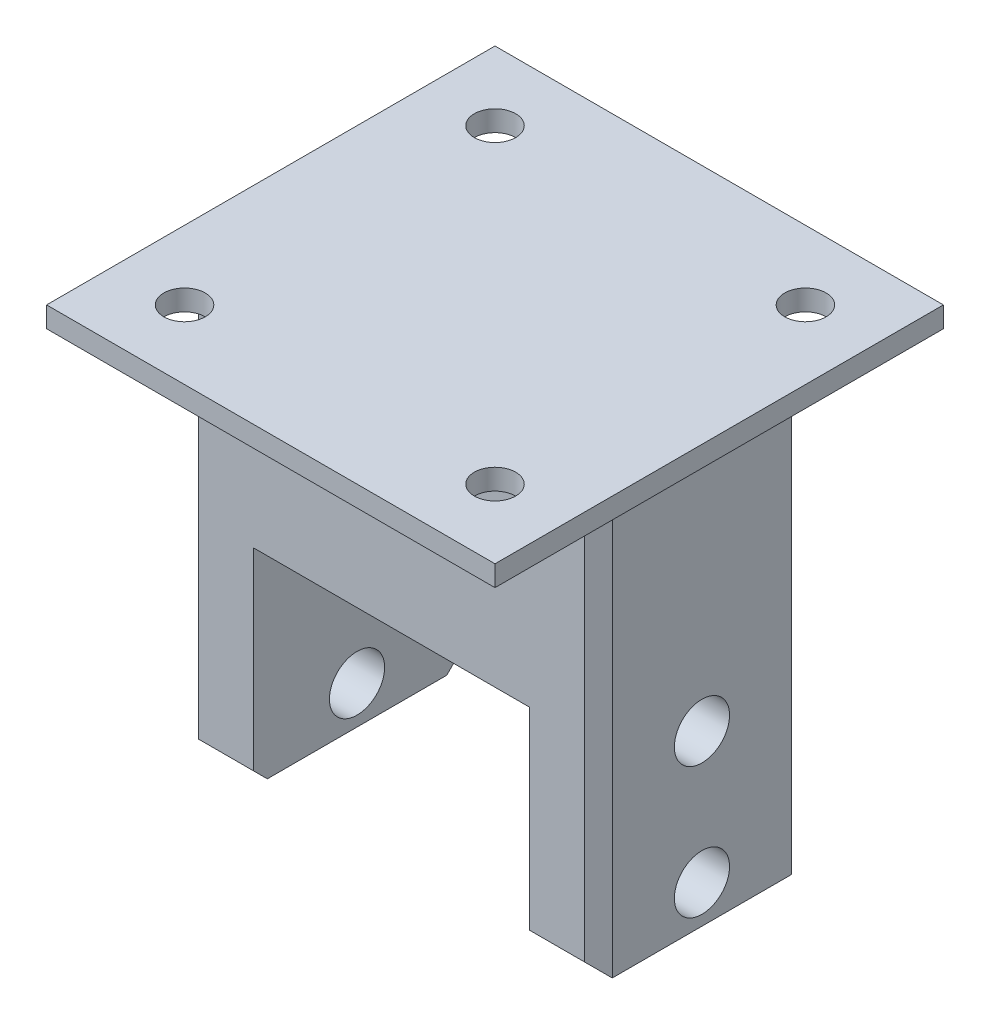
ISO-10303-21;
HEADER;
FILE_DESCRIPTION(('STEP AP214'),'2;1');
FILE_NAME('part.step','',(''),(''),'','','');
FILE_SCHEMA(('AUTOMOTIVE_DESIGN { 1 0 10303 214 1 1 1 1 }'));
ENDSEC;
DATA;
#1=APPLICATION_CONTEXT('core data for automotive mechanical design processes');
#2=APPLICATION_PROTOCOL_DEFINITION('international standard','automotive_design',2000,#1);
#3=PRODUCT_CONTEXT('',#1,'mechanical');
#4=PRODUCT('Part','Part','',(#3));
#5=PRODUCT_RELATED_PRODUCT_CATEGORY('part','',(#4));
#6=PRODUCT_DEFINITION_FORMATION('','',#4);
#7=PRODUCT_DEFINITION_CONTEXT('part definition',#1,'design');
#8=PRODUCT_DEFINITION('design','',#6,#7);
#9=PRODUCT_DEFINITION_SHAPE('','',#8);
#10=(LENGTH_UNIT() NAMED_UNIT(*) SI_UNIT(.MILLI.,.METRE.));
#11=(NAMED_UNIT(*) PLANE_ANGLE_UNIT() SI_UNIT($,.RADIAN.));
#12=(NAMED_UNIT(*) SI_UNIT($,.STERADIAN.) SOLID_ANGLE_UNIT());
#13=UNCERTAINTY_MEASURE_WITH_UNIT(LENGTH_MEASURE(1.E-05),#10,'distance_accuracy_value','');
#14=(GEOMETRIC_REPRESENTATION_CONTEXT(3) GLOBAL_UNCERTAINTY_ASSIGNED_CONTEXT((#13)) GLOBAL_UNIT_ASSIGNED_CONTEXT((#10,
#11,#12)) REPRESENTATION_CONTEXT('',''));
#15=CARTESIAN_POINT('',(0.,0.,0.));
#16=DIRECTION('',(0.,0.,1.));
#17=DIRECTION('',(1.,0.,0.));
#18=AXIS2_PLACEMENT_3D('',#15,#16,#17);
#19=CARTESIAN_POINT('',(-30.,-30.,30.));
#20=DIRECTION('',(1.,0.,0.));
#21=DIRECTION('',(0.,0.,-1.));
#22=AXIS2_PLACEMENT_3D('',#19,#20,#21);
#23=PLANE('',#22);
#24=CARTESIAN_POINT('',(-30.,-24.5,15.));
#25=DIRECTION('',(-1.,0.,0.));
#26=DIRECTION('',(0.,0.,1.));
#27=AXIS2_PLACEMENT_3D('',#24,#25,#26);
#28=CIRCLE('',#27,4.);
#29=CARTESIAN_POINT('',(-30.,-24.5,19.));
#30=VERTEX_POINT('',#29);
#31=EDGE_CURVE('E188',#30,#30,#28,.T.);
#32=ORIENTED_EDGE('',*,*,#31,.F.);
#33=EDGE_LOOP('',(#32));
#34=FACE_BOUND('',#33,.T.);
#35=CARTESIAN_POINT('',(-30.,-5.5,15.));
#36=DIRECTION('',(-1.,0.,0.));
#37=DIRECTION('',(0.,0.,1.));
#38=AXIS2_PLACEMENT_3D('',#35,#36,#37);
#39=CIRCLE('',#38,4.);
#40=CARTESIAN_POINT('',(-30.,-5.5,19.));
#41=VERTEX_POINT('',#40);
#42=EDGE_CURVE('E205',#41,#41,#39,.T.);
#43=ORIENTED_EDGE('',*,*,#42,.F.);
#44=EDGE_LOOP('',(#43));
#45=FACE_BOUND('',#44,.T.);
#46=DIRECTION('',(0.,0.,-1.));
#47=VECTOR('',#46,1.);
#48=CARTESIAN_POINT('',(-30.,-30.,30.));
#49=LINE('',#48,#47);
#50=CARTESIAN_POINT('',(-30.,-30.,28.));
#51=VERTEX_POINT('',#50);
#52=CARTESIAN_POINT('',(-30.,-30.,2.00000000000002));
#53=VERTEX_POINT('',#52);
#54=EDGE_CURVE('E256',#51,#53,#49,.T.);
#55=ORIENTED_EDGE('',*,*,#54,.F.);
#56=DIRECTION('',(0.,1.,0.));
#57=VECTOR('',#56,1.);
#58=CARTESIAN_POINT('',(-30.,-30.,28.));
#59=LINE('',#58,#57);
#60=CARTESIAN_POINT('',(-30.,30.,28.));
#61=VERTEX_POINT('',#60);
#62=EDGE_CURVE('E57',#51,#61,#59,.T.);
#63=ORIENTED_EDGE('',*,*,#62,.T.);
#64=DIRECTION('',(0.,0.,-1.));
#65=VECTOR('',#64,1.);
#66=CARTESIAN_POINT('',(-30.,30.,30.));
#67=LINE('',#66,#65);
#68=CARTESIAN_POINT('',(-30.,30.,2.00000000000002));
#69=VERTEX_POINT('',#68);
#70=EDGE_CURVE('E229',#61,#69,#67,.T.);
#71=ORIENTED_EDGE('',*,*,#70,.T.);
#72=DIRECTION('',(0.,-1.,0.));
#73=VECTOR('',#72,1.);
#74=CARTESIAN_POINT('',(-30.,-30.,2.00000000000002));
#75=LINE('',#74,#73);
#76=EDGE_CURVE('E299',#69,#53,#75,.T.);
#77=ORIENTED_EDGE('',*,*,#76,.T.);
#78=EDGE_LOOP('',(#55,#63,#71,#77));
#79=FACE_BOUND('',#78,.T.);
#80=ADVANCED_FACE('F35',(#34,#45,#79),#23,.F.);
#81=CARTESIAN_POINT('',(-30.,-30.,30.));
#82=DIRECTION('',(0.,1.,0.));
#83=DIRECTION('',(0.,0.,1.));
#84=AXIS2_PLACEMENT_3D('',#81,#82,#83);
#85=PLANE('',#84);
#86=DIRECTION('',(0.,0.,-1.));
#87=VECTOR('',#86,1.);
#88=CARTESIAN_POINT('',(-20.,-30.,30.));
#89=LINE('',#88,#87);
#90=CARTESIAN_POINT('',(-20.,-30.,28.));
#91=VERTEX_POINT('',#90);
#92=CARTESIAN_POINT('',(-20.,-30.,2.00000000000002));
#93=VERTEX_POINT('',#92);
#94=EDGE_CURVE('E253',#91,#93,#89,.T.);
#95=ORIENTED_EDGE('',*,*,#94,.F.);
#96=DIRECTION('',(-1.,0.,0.));
#97=VECTOR('',#96,1.);
#98=CARTESIAN_POINT('',(-30.,-30.,28.));
#99=LINE('',#98,#97);
#100=EDGE_CURVE('E297',#91,#51,#99,.T.);
#101=ORIENTED_EDGE('',*,*,#100,.T.);
#102=ORIENTED_EDGE('',*,*,#54,.T.);
#103=DIRECTION('',(1.,0.,0.));
#104=VECTOR('',#103,1.);
#105=CARTESIAN_POINT('',(-20.,-30.,2.00000000000002));
#106=LINE('',#105,#104);
#107=EDGE_CURVE('E294',#53,#93,#106,.T.);
#108=ORIENTED_EDGE('',*,*,#107,.T.);
#109=EDGE_LOOP('',(#95,#101,#102,#108));
#110=FACE_BOUND('',#109,.T.);
#111=ADVANCED_FACE('F376',(#110),#85,.F.);
#112=CARTESIAN_POINT('',(-20.,-30.,30.));
#113=DIRECTION('',(-1.,0.,0.));
#114=DIRECTION('',(0.,0.,1.));
#115=AXIS2_PLACEMENT_3D('',#112,#113,#114);
#116=PLANE('',#115);
#117=CARTESIAN_POINT('',(-20.,-24.5,15.));
#118=DIRECTION('',(-1.,0.,0.));
#119=DIRECTION('',(0.,0.,1.));
#120=AXIS2_PLACEMENT_3D('',#117,#118,#119);
#121=CIRCLE('',#120,4.);
#122=CARTESIAN_POINT('',(-20.,-24.5,19.));
#123=VERTEX_POINT('',#122);
#124=EDGE_CURVE('E202',#123,#123,#121,.T.);
#125=ORIENTED_EDGE('',*,*,#124,.T.);
#126=EDGE_LOOP('',(#125));
#127=FACE_BOUND('',#126,.T.);
#128=CARTESIAN_POINT('',(-20.,-5.5,15.));
#129=DIRECTION('',(-1.,0.,0.));
#130=DIRECTION('',(0.,0.,1.));
#131=AXIS2_PLACEMENT_3D('',#128,#129,#130);
#132=CIRCLE('',#131,4.);
#133=CARTESIAN_POINT('',(-20.,-5.5,19.));
#134=VERTEX_POINT('',#133);
#135=EDGE_CURVE('E214',#134,#134,#132,.T.);
#136=ORIENTED_EDGE('',*,*,#135,.T.);
#137=EDGE_LOOP('',(#136));
#138=FACE_BOUND('',#137,.T.);
#139=DIRECTION('',(0.,1.,0.));
#140=VECTOR('',#139,1.);
#141=CARTESIAN_POINT('',(-20.,-30.,30.));
#142=LINE('',#141,#140);
#143=CARTESIAN_POINT('',(-20.,-28.,30.));
#144=VERTEX_POINT('',#143);
#145=CARTESIAN_POINT('',(-20.,0.,30.));
#146=VERTEX_POINT('',#145);
#147=EDGE_CURVE('E218',#144,#146,#142,.T.);
#148=ORIENTED_EDGE('',*,*,#147,.F.);
#149=DIRECTION('',(0.,0.707106781186548,0.707106781186548));
#150=VECTOR('',#149,1.);
#151=CARTESIAN_POINT('',(-20.,-28.,30.));
#152=LINE('',#151,#150);
#153=EDGE_CURVE('E292',#144,#91,#152,.F.);
#154=ORIENTED_EDGE('',*,*,#153,.T.);
#155=ORIENTED_EDGE('',*,*,#94,.T.);
#156=DIRECTION('',(0.,0.70710678118655,-0.707106781186545));
#157=VECTOR('',#156,1.);
#158=CARTESIAN_POINT('',(-20.,-30.,2.00000000000002));
#159=LINE('',#158,#157);
#160=CARTESIAN_POINT('',(-20.,-28.,0.));
#161=VERTEX_POINT('',#160);
#162=EDGE_CURVE('E290',#93,#161,#159,.T.);
#163=ORIENTED_EDGE('',*,*,#162,.T.);
#164=DIRECTION('',(0.,1.,0.));
#165=VECTOR('',#164,1.);
#166=CARTESIAN_POINT('',(-20.,-30.,0.));
#167=LINE('',#166,#165);
#168=CARTESIAN_POINT('',(-20.,0.,0.));
#169=VERTEX_POINT('',#168);
#170=EDGE_CURVE('E217',#161,#169,#167,.T.);
#171=ORIENTED_EDGE('',*,*,#170,.T.);
#172=DIRECTION('',(0.,0.,-1.));
#173=VECTOR('',#172,1.);
#174=CARTESIAN_POINT('',(-20.,0.,30.));
#175=LINE('',#174,#173);
#176=EDGE_CURVE('E250',#146,#169,#175,.T.);
#177=ORIENTED_EDGE('',*,*,#176,.F.);
#178=EDGE_LOOP('',(#148,#154,#155,#163,#171,#177));
#179=FACE_BOUND('',#178,.T.);
#180=ADVANCED_FACE('F373',(#127,#138,#179),#116,.F.);
#181=CARTESIAN_POINT('',(-20.,0.,30.));
#182=DIRECTION('',(0.,1.,0.));
#183=DIRECTION('',(0.,0.,1.));
#184=AXIS2_PLACEMENT_3D('',#181,#182,#183);
#185=PLANE('',#184);
#186=DIRECTION('',(1.,0.,0.));
#187=VECTOR('',#186,1.);
#188=CARTESIAN_POINT('',(-20.,0.,0.));
#189=LINE('',#188,#187);
#190=CARTESIAN_POINT('',(20.,0.,0.));
#191=VERTEX_POINT('',#190);
#192=EDGE_CURVE('E231',#169,#191,#189,.T.);
#193=ORIENTED_EDGE('',*,*,#192,.T.);
#194=DIRECTION('',(0.,0.,-1.));
#195=VECTOR('',#194,1.);
#196=CARTESIAN_POINT('',(20.,0.,30.));
#197=LINE('',#196,#195);
#198=CARTESIAN_POINT('',(20.,0.,30.));
#199=VERTEX_POINT('',#198);
#200=EDGE_CURVE('E247',#199,#191,#197,.T.);
#201=ORIENTED_EDGE('',*,*,#200,.F.);
#202=DIRECTION('',(1.,0.,0.));
#203=VECTOR('',#202,1.);
#204=CARTESIAN_POINT('',(-20.,0.,30.));
#205=LINE('',#204,#203);
#206=EDGE_CURVE('E220',#146,#199,#205,.T.);
#207=ORIENTED_EDGE('',*,*,#206,.F.);
#208=ORIENTED_EDGE('',*,*,#176,.T.);
#209=EDGE_LOOP('',(#193,#201,#207,#208));
#210=FACE_BOUND('',#209,.T.);
#211=ADVANCED_FACE('F369',(#210),#185,.F.);
#212=CARTESIAN_POINT('',(20.,-30.,30.));
#213=DIRECTION('',(1.,0.,0.));
#214=DIRECTION('',(0.,0.,-1.));
#215=AXIS2_PLACEMENT_3D('',#212,#213,#214);
#216=PLANE('',#215);
#217=CARTESIAN_POINT('',(20.,-24.5,15.));
#218=DIRECTION('',(1.,0.,0.));
#219=DIRECTION('',(0.,0.,-1.));
#220=AXIS2_PLACEMENT_3D('',#217,#218,#219);
#221=CIRCLE('',#220,4.);
#222=CARTESIAN_POINT('',(20.,-24.5,11.));
#223=VERTEX_POINT('',#222);
#224=EDGE_CURVE('E198',#223,#223,#221,.T.);
#225=ORIENTED_EDGE('',*,*,#224,.T.);
#226=EDGE_LOOP('',(#225));
#227=FACE_BOUND('',#226,.T.);
#228=CARTESIAN_POINT('',(20.,-5.5,15.));
#229=DIRECTION('',(1.,0.,0.));
#230=DIRECTION('',(0.,0.,-1.));
#231=AXIS2_PLACEMENT_3D('',#228,#229,#230);
#232=CIRCLE('',#231,4.);
#233=CARTESIAN_POINT('',(20.,-5.5,11.));
#234=VERTEX_POINT('',#233);
#235=EDGE_CURVE('E209',#234,#234,#232,.T.);
#236=ORIENTED_EDGE('',*,*,#235,.T.);
#237=EDGE_LOOP('',(#236));
#238=FACE_BOUND('',#237,.T.);
#239=DIRECTION('',(0.,-1.,0.));
#240=VECTOR('',#239,1.);
#241=CARTESIAN_POINT('',(20.,-30.,0.));
#242=LINE('',#241,#240);
#243=CARTESIAN_POINT('',(20.,-28.,0.));
#244=VERTEX_POINT('',#243);
#245=EDGE_CURVE('E233',#191,#244,#242,.T.);
#246=ORIENTED_EDGE('',*,*,#245,.T.);
#247=DIRECTION('',(0.,-0.70710678118655,0.707106781186545));
#248=VECTOR('',#247,1.);
#249=CARTESIAN_POINT('',(20.,-30.,2.00000000000002));
#250=LINE('',#249,#248);
#251=CARTESIAN_POINT('',(20.,-30.,2.00000000000002));
#252=VERTEX_POINT('',#251);
#253=EDGE_CURVE('E274',#244,#252,#250,.T.);
#254=ORIENTED_EDGE('',*,*,#253,.T.);
#255=DIRECTION('',(0.,0.,-1.));
#256=VECTOR('',#255,1.);
#257=CARTESIAN_POINT('',(20.,-30.,30.));
#258=LINE('',#257,#256);
#259=CARTESIAN_POINT('',(20.,-30.,28.));
#260=VERTEX_POINT('',#259);
#261=EDGE_CURVE('E244',#260,#252,#258,.T.);
#262=ORIENTED_EDGE('',*,*,#261,.F.);
#263=DIRECTION('',(0.,-0.707106781186548,-0.707106781186548));
#264=VECTOR('',#263,1.);
#265=CARTESIAN_POINT('',(20.,-28.,30.));
#266=LINE('',#265,#264);
#267=CARTESIAN_POINT('',(20.,-28.,30.));
#268=VERTEX_POINT('',#267);
#269=EDGE_CURVE('E272',#260,#268,#266,.F.);
#270=ORIENTED_EDGE('',*,*,#269,.T.);
#271=DIRECTION('',(0.,-1.,0.));
#272=VECTOR('',#271,1.);
#273=CARTESIAN_POINT('',(20.,-30.,30.));
#274=LINE('',#273,#272);
#275=EDGE_CURVE('E223',#199,#268,#274,.T.);
#276=ORIENTED_EDGE('',*,*,#275,.F.);
#277=ORIENTED_EDGE('',*,*,#200,.T.);
#278=EDGE_LOOP('',(#246,#254,#262,#270,#276,#277));
#279=FACE_BOUND('',#278,.T.);
#280=ADVANCED_FACE('F347',(#227,#238,#279),#216,.F.);
#281=CARTESIAN_POINT('',(30.,-30.,30.));
#282=DIRECTION('',(0.,1.,0.));
#283=DIRECTION('',(0.,0.,1.));
#284=AXIS2_PLACEMENT_3D('',#281,#282,#283);
#285=PLANE('',#284);
#286=ORIENTED_EDGE('',*,*,#261,.T.);
#287=DIRECTION('',(1.,0.,0.));
#288=VECTOR('',#287,1.);
#289=CARTESIAN_POINT('',(30.,-30.,2.00000000000002));
#290=LINE('',#289,#288);
#291=CARTESIAN_POINT('',(30.,-30.,2.00000000000002));
#292=VERTEX_POINT('',#291);
#293=EDGE_CURVE('E261',#252,#292,#290,.T.);
#294=ORIENTED_EDGE('',*,*,#293,.T.);
#295=DIRECTION('',(0.,0.,-1.));
#296=VECTOR('',#295,1.);
#297=CARTESIAN_POINT('',(30.,-30.,30.));
#298=LINE('',#297,#296);
#299=CARTESIAN_POINT('',(30.,-30.,28.));
#300=VERTEX_POINT('',#299);
#301=EDGE_CURVE('E241',#300,#292,#298,.T.);
#302=ORIENTED_EDGE('',*,*,#301,.F.);
#303=DIRECTION('',(-1.,0.,0.));
#304=VECTOR('',#303,1.);
#305=CARTESIAN_POINT('',(30.,-30.,28.));
#306=LINE('',#305,#304);
#307=EDGE_CURVE('E259',#300,#260,#306,.T.);
#308=ORIENTED_EDGE('',*,*,#307,.T.);
#309=EDGE_LOOP('',(#286,#294,#302,#308));
#310=FACE_BOUND('',#309,.T.);
#311=ADVANCED_FACE('F350',(#310),#285,.F.);
#312=CARTESIAN_POINT('',(30.,-30.,30.));
#313=DIRECTION('',(-1.,0.,0.));
#314=DIRECTION('',(0.,0.,1.));
#315=AXIS2_PLACEMENT_3D('',#312,#313,#314);
#316=PLANE('',#315);
#317=CARTESIAN_POINT('',(30.,-24.5,15.));
#318=DIRECTION('',(-1.,0.,0.));
#319=DIRECTION('',(0.,0.,1.));
#320=AXIS2_PLACEMENT_3D('',#317,#318,#319);
#321=CIRCLE('',#320,4.);
#322=CARTESIAN_POINT('',(30.,-24.5,19.));
#323=VERTEX_POINT('',#322);
#324=EDGE_CURVE('E191',#323,#323,#321,.T.);
#325=ORIENTED_EDGE('',*,*,#324,.T.);
#326=EDGE_LOOP('',(#325));
#327=FACE_BOUND('',#326,.T.);
#328=CARTESIAN_POINT('',(30.,-5.5,15.));
#329=DIRECTION('',(-1.,0.,0.));
#330=DIRECTION('',(0.,0.,1.));
#331=AXIS2_PLACEMENT_3D('',#328,#329,#330);
#332=CIRCLE('',#331,4.);
#333=CARTESIAN_POINT('',(30.,-5.5,19.));
#334=VERTEX_POINT('',#333);
#335=EDGE_CURVE('E206',#334,#334,#332,.T.);
#336=ORIENTED_EDGE('',*,*,#335,.T.);
#337=EDGE_LOOP('',(#336));
#338=FACE_BOUND('',#337,.T.);
#339=ORIENTED_EDGE('',*,*,#301,.T.);
#340=DIRECTION('',(0.,1.,0.));
#341=VECTOR('',#340,1.);
#342=CARTESIAN_POINT('',(30.,30.,2.00000000000002));
#343=LINE('',#342,#341);
#344=CARTESIAN_POINT('',(30.,30.,2.00000000000002));
#345=VERTEX_POINT('',#344);
#346=EDGE_CURVE('E278',#292,#345,#343,.T.);
#347=ORIENTED_EDGE('',*,*,#346,.T.);
#348=DIRECTION('',(0.,0.,-1.));
#349=VECTOR('',#348,1.);
#350=CARTESIAN_POINT('',(30.,30.,30.));
#351=LINE('',#350,#349);
#352=CARTESIAN_POINT('',(30.,30.,28.));
#353=VERTEX_POINT('',#352);
#354=EDGE_CURVE('E238',#353,#345,#351,.T.);
#355=ORIENTED_EDGE('',*,*,#354,.F.);
#356=DIRECTION('',(0.,-1.,0.));
#357=VECTOR('',#356,1.);
#358=CARTESIAN_POINT('',(30.,-30.,28.));
#359=LINE('',#358,#357);
#360=EDGE_CURVE('E276',#353,#300,#359,.T.);
#361=ORIENTED_EDGE('',*,*,#360,.T.);
#362=EDGE_LOOP('',(#339,#347,#355,#361));
#363=FACE_BOUND('',#362,.T.);
#364=ADVANCED_FACE('F584',(#327,#338,#363),#316,.F.);
#365=CARTESIAN_POINT('',(0.,0.,30.));
#366=DIRECTION('',(0.,0.,-1.));
#367=DIRECTION('',(-1.,0.,0.));
#368=AXIS2_PLACEMENT_3D('',#365,#366,#367);
#369=PLANE('',#368);
#370=ORIENTED_EDGE('',*,*,#275,.T.);
#371=DIRECTION('',(1.,0.,0.));
#372=VECTOR('',#371,1.);
#373=CARTESIAN_POINT('',(0.,-28.,30.));
#374=LINE('',#373,#372);
#375=CARTESIAN_POINT('',(28.,-28.,30.));
#376=VERTEX_POINT('',#375);
#377=EDGE_CURVE('E287',#268,#376,#374,.T.);
#378=ORIENTED_EDGE('',*,*,#377,.T.);
#379=DIRECTION('',(0.,1.,0.));
#380=VECTOR('',#379,1.);
#381=CARTESIAN_POINT('',(28.,0.,30.));
#382=LINE('',#381,#380);
#383=CARTESIAN_POINT('',(28.,30.,30.));
#384=VERTEX_POINT('',#383);
#385=EDGE_CURVE('E285',#376,#384,#382,.T.);
#386=ORIENTED_EDGE('',*,*,#385,.T.);
#387=DIRECTION('',(-1.,0.,0.));
#388=VECTOR('',#387,1.);
#389=CARTESIAN_POINT('',(-30.,30.,30.));
#390=LINE('',#389,#388);
#391=CARTESIAN_POINT('',(-28.,30.,30.));
#392=VERTEX_POINT('',#391);
#393=EDGE_CURVE('E226',#384,#392,#390,.T.);
#394=ORIENTED_EDGE('',*,*,#393,.T.);
#395=DIRECTION('',(0.,-1.,0.));
#396=VECTOR('',#395,1.);
#397=CARTESIAN_POINT('',(-28.,0.,30.));
#398=LINE('',#397,#396);
#399=CARTESIAN_POINT('',(-28.,-28.,30.));
#400=VERTEX_POINT('',#399);
#401=EDGE_CURVE('E280',#392,#400,#398,.T.);
#402=ORIENTED_EDGE('',*,*,#401,.T.);
#403=DIRECTION('',(1.,0.,0.));
#404=VECTOR('',#403,1.);
#405=CARTESIAN_POINT('',(0.,-28.,30.));
#406=LINE('',#405,#404);
#407=EDGE_CURVE('E282',#400,#144,#406,.T.);
#408=ORIENTED_EDGE('',*,*,#407,.T.);
#409=ORIENTED_EDGE('',*,*,#147,.T.);
#410=ORIENTED_EDGE('',*,*,#206,.T.);
#411=EDGE_LOOP('',(#370,#378,#386,#394,#402,#408,#409,#410));
#412=FACE_BOUND('',#411,.T.);
#413=ADVANCED_FACE('F363',(#412),#369,.F.);
#414=CARTESIAN_POINT('',(0.,0.,0.));
#415=DIRECTION('',(0.,0.,-1.));
#416=DIRECTION('',(-1.,0.,0.));
#417=AXIS2_PLACEMENT_3D('',#414,#415,#416);
#418=PLANE('',#417);
#419=DIRECTION('',(0.,-1.,0.));
#420=VECTOR('',#419,1.);
#421=CARTESIAN_POINT('',(28.,-30.,0.));
#422=LINE('',#421,#420);
#423=CARTESIAN_POINT('',(28.,30.,0.));
#424=VERTEX_POINT('',#423);
#425=CARTESIAN_POINT('',(28.,-28.,0.));
#426=VERTEX_POINT('',#425);
#427=EDGE_CURVE('E268',#424,#426,#422,.T.);
#428=ORIENTED_EDGE('',*,*,#427,.T.);
#429=DIRECTION('',(-1.,0.,0.));
#430=VECTOR('',#429,1.);
#431=CARTESIAN_POINT('',(20.,-28.,0.));
#432=LINE('',#431,#430);
#433=EDGE_CURVE('E270',#426,#244,#432,.T.);
#434=ORIENTED_EDGE('',*,*,#433,.T.);
#435=ORIENTED_EDGE('',*,*,#245,.F.);
#436=ORIENTED_EDGE('',*,*,#192,.F.);
#437=ORIENTED_EDGE('',*,*,#170,.F.);
#438=DIRECTION('',(-1.,0.,0.));
#439=VECTOR('',#438,1.);
#440=CARTESIAN_POINT('',(-30.,-28.,0.));
#441=LINE('',#440,#439);
#442=CARTESIAN_POINT('',(-28.,-28.,0.));
#443=VERTEX_POINT('',#442);
#444=EDGE_CURVE('E266',#161,#443,#441,.T.);
#445=ORIENTED_EDGE('',*,*,#444,.T.);
#446=DIRECTION('',(0.,1.,0.));
#447=VECTOR('',#446,1.);
#448=CARTESIAN_POINT('',(-28.,30.,0.));
#449=LINE('',#448,#447);
#450=CARTESIAN_POINT('',(-28.,30.,0.));
#451=VERTEX_POINT('',#450);
#452=EDGE_CURVE('E264',#443,#451,#449,.T.);
#453=ORIENTED_EDGE('',*,*,#452,.T.);
#454=DIRECTION('',(-1.,0.,0.));
#455=VECTOR('',#454,1.);
#456=CARTESIAN_POINT('',(-30.,30.,0.));
#457=LINE('',#456,#455);
#458=EDGE_CURVE('E221',#424,#451,#457,.T.);
#459=ORIENTED_EDGE('',*,*,#458,.F.);
#460=EDGE_LOOP('',(#428,#434,#435,#436,#437,#445,#453,#459));
#461=FACE_BOUND('',#460,.T.);
#462=ADVANCED_FACE('F328',(#461),#418,.T.);
#463=CARTESIAN_POINT('',(30.,-5.5,15.));
#464=DIRECTION('',(-1.,0.,0.));
#465=DIRECTION('',(0.,0.,1.));
#466=AXIS2_PLACEMENT_3D('',#463,#464,#465);
#467=CYLINDRICAL_SURFACE('',#466,4.);
#468=ORIENTED_EDGE('',*,*,#335,.F.);
#469=EDGE_LOOP('',(#468));
#470=FACE_BOUND('',#469,.T.);
#471=ORIENTED_EDGE('',*,*,#235,.F.);
#472=EDGE_LOOP('',(#471));
#473=FACE_BOUND('',#472,.T.);
#474=ADVANCED_FACE('F561',(#470,#473),#467,.F.);
#475=ORIENTED_EDGE('',*,*,#42,.T.);
#476=EDGE_LOOP('',(#475));
#477=FACE_BOUND('',#476,.T.);
#478=ORIENTED_EDGE('',*,*,#135,.F.);
#479=EDGE_LOOP('',(#478));
#480=FACE_BOUND('',#479,.T.);
#481=ADVANCED_FACE('F553',(#477,#480),#467,.F.);
#482=CARTESIAN_POINT('',(30.,-24.5,15.));
#483=DIRECTION('',(-1.,0.,0.));
#484=DIRECTION('',(0.,0.,1.));
#485=AXIS2_PLACEMENT_3D('',#482,#483,#484);
#486=CYLINDRICAL_SURFACE('',#485,4.);
#487=ORIENTED_EDGE('',*,*,#324,.F.);
#488=EDGE_LOOP('',(#487));
#489=FACE_BOUND('',#488,.T.);
#490=ORIENTED_EDGE('',*,*,#224,.F.);
#491=EDGE_LOOP('',(#490));
#492=FACE_BOUND('',#491,.T.);
#493=ADVANCED_FACE('F544',(#489,#492),#486,.F.);
#494=ORIENTED_EDGE('',*,*,#31,.T.);
#495=EDGE_LOOP('',(#494));
#496=FACE_BOUND('',#495,.T.);
#497=ORIENTED_EDGE('',*,*,#124,.F.);
#498=EDGE_LOOP('',(#497));
#499=FACE_BOUND('',#498,.T.);
#500=ADVANCED_FACE('F535',(#496,#499),#486,.F.);
#501=CARTESIAN_POINT('',(0.,30.,0.));
#502=DIRECTION('',(0.,-1.,0.));
#503=DIRECTION('',(0.,0.,-1.));
#504=AXIS2_PLACEMENT_3D('',#501,#502,#503);
#505=PLANE('',#504);
#506=CARTESIAN_POINT('',(22.5,30.,-7.5));
#507=DIRECTION('',(0.,1.,0.));
#508=DIRECTION('',(0.,0.,1.));
#509=AXIS2_PLACEMENT_3D('',#506,#507,#508);
#510=CIRCLE('',#509,3.);
#511=CARTESIAN_POINT('',(22.5,30.,-4.5));
#512=VERTEX_POINT('',#511);
#513=EDGE_CURVE('E309',#512,#512,#510,.T.);
#514=ORIENTED_EDGE('',*,*,#513,.T.);
#515=EDGE_LOOP('',(#514));
#516=FACE_BOUND('',#515,.T.);
#517=CARTESIAN_POINT('',(-22.5,30.,37.5));
#518=DIRECTION('',(0.,1.,0.));
#519=DIRECTION('',(0.,0.,1.));
#520=AXIS2_PLACEMENT_3D('',#517,#518,#519);
#521=CIRCLE('',#520,3.);
#522=CARTESIAN_POINT('',(-22.5,30.,40.5));
#523=VERTEX_POINT('',#522);
#524=EDGE_CURVE('E675',#523,#523,#521,.T.);
#525=ORIENTED_EDGE('',*,*,#524,.T.);
#526=EDGE_LOOP('',(#525));
#527=FACE_BOUND('',#526,.T.);
#528=DIRECTION('',(0.,0.,1.));
#529=VECTOR('',#528,1.);
#530=CARTESIAN_POINT('',(-32.5,30.,-17.5));
#531=LINE('',#530,#529);
#532=CARTESIAN_POINT('',(-32.5,30.,-17.5));
#533=VERTEX_POINT('',#532);
#534=CARTESIAN_POINT('',(-32.5,30.,47.5));
#535=VERTEX_POINT('',#534);
#536=EDGE_CURVE('E187',#533,#535,#531,.T.);
#537=ORIENTED_EDGE('',*,*,#536,.F.);
#538=DIRECTION('',(-1.,0.,0.));
#539=VECTOR('',#538,1.);
#540=CARTESIAN_POINT('',(32.5,30.,-17.5));
#541=LINE('',#540,#539);
#542=CARTESIAN_POINT('',(32.5,30.,-17.5));
#543=VERTEX_POINT('',#542);
#544=EDGE_CURVE('E183',#543,#533,#541,.T.);
#545=ORIENTED_EDGE('',*,*,#544,.F.);
#546=DIRECTION('',(0.,0.,-1.));
#547=VECTOR('',#546,1.);
#548=CARTESIAN_POINT('',(32.5,30.,-17.5));
#549=LINE('',#548,#547);
#550=CARTESIAN_POINT('',(32.5,30.,47.5));
#551=VERTEX_POINT('',#550);
#552=EDGE_CURVE('E709',#551,#543,#549,.T.);
#553=ORIENTED_EDGE('',*,*,#552,.F.);
#554=DIRECTION('',(1.,0.,0.));
#555=VECTOR('',#554,1.);
#556=CARTESIAN_POINT('',(32.5,30.,47.5));
#557=LINE('',#556,#555);
#558=EDGE_CURVE('E707',#535,#551,#557,.T.);
#559=ORIENTED_EDGE('',*,*,#558,.F.);
#560=EDGE_LOOP('',(#537,#545,#553,#559));
#561=FACE_BOUND('',#560,.T.);
#562=CARTESIAN_POINT('',(22.5,30.,37.5));
#563=DIRECTION('',(0.,1.,0.));
#564=DIRECTION('',(0.,0.,1.));
#565=AXIS2_PLACEMENT_3D('',#562,#563,#564);
#566=CIRCLE('',#565,3.);
#567=CARTESIAN_POINT('',(22.5,30.,40.5));
#568=VERTEX_POINT('',#567);
#569=EDGE_CURVE('E681',#568,#568,#566,.T.);
#570=ORIENTED_EDGE('',*,*,#569,.T.);
#571=EDGE_LOOP('',(#570));
#572=FACE_BOUND('',#571,.T.);
#573=CARTESIAN_POINT('',(-22.5,30.,-7.5));
#574=DIRECTION('',(0.,1.,0.));
#575=DIRECTION('',(0.,0.,1.));
#576=AXIS2_PLACEMENT_3D('',#573,#574,#575);
#577=CIRCLE('',#576,3.);
#578=CARTESIAN_POINT('',(-22.5,30.,-4.5));
#579=VERTEX_POINT('',#578);
#580=EDGE_CURVE('E684',#579,#579,#577,.T.);
#581=ORIENTED_EDGE('',*,*,#580,.T.);
#582=EDGE_LOOP('',(#581));
#583=FACE_BOUND('',#582,.T.);
#584=ORIENTED_EDGE('',*,*,#393,.F.);
#585=DIRECTION('',(-0.707106781186548,0.,0.707106781186548));
#586=VECTOR('',#585,1.);
#587=CARTESIAN_POINT('',(28.,30.,30.));
#588=LINE('',#587,#586);
#589=EDGE_CURVE('E304',#384,#353,#588,.F.);
#590=ORIENTED_EDGE('',*,*,#589,.T.);
#591=ORIENTED_EDGE('',*,*,#354,.T.);
#592=DIRECTION('',(-0.70710678118655,0.,-0.707106781186545));
#593=VECTOR('',#592,1.);
#594=CARTESIAN_POINT('',(30.,30.,2.00000000000002));
#595=LINE('',#594,#593);
#596=EDGE_CURVE('E302',#345,#424,#595,.T.);
#597=ORIENTED_EDGE('',*,*,#596,.T.);
#598=ORIENTED_EDGE('',*,*,#458,.T.);
#599=DIRECTION('',(-0.70710678118655,0.,0.707106781186545));
#600=VECTOR('',#599,1.);
#601=CARTESIAN_POINT('',(-30.,30.,2.00000000000002));
#602=LINE('',#601,#600);
#603=EDGE_CURVE('E11',#451,#69,#602,.T.);
#604=ORIENTED_EDGE('',*,*,#603,.T.);
#605=ORIENTED_EDGE('',*,*,#70,.F.);
#606=DIRECTION('',(-0.707106781186548,0.,-0.707106781186548));
#607=VECTOR('',#606,1.);
#608=CARTESIAN_POINT('',(-28.,30.,30.));
#609=LINE('',#608,#607);
#610=EDGE_CURVE('E44',#61,#392,#609,.F.);
#611=ORIENTED_EDGE('',*,*,#610,.T.);
#612=EDGE_LOOP('',(#584,#590,#591,#597,#598,#604,#605,#611));
#613=FACE_BOUND('',#612,.T.);
#614=ADVANCED_FACE('F332',(#516,#527,#561,#572,#583,#613),#505,.T.);
#615=CARTESIAN_POINT('',(0.,33.,0.));
#616=DIRECTION('',(0.,-1.,0.));
#617=DIRECTION('',(0.,0.,-1.));
#618=AXIS2_PLACEMENT_3D('',#615,#616,#617);
#619=PLANE('',#618);
#620=DIRECTION('',(0.,0.,1.));
#621=VECTOR('',#620,1.);
#622=CARTESIAN_POINT('',(-32.5,33.,-17.5));
#623=LINE('',#622,#621);
#624=CARTESIAN_POINT('',(-32.5,33.,-17.5));
#625=VERTEX_POINT('',#624);
#626=CARTESIAN_POINT('',(-32.5,33.,47.5));
#627=VERTEX_POINT('',#626);
#628=EDGE_CURVE('E173',#625,#627,#623,.T.);
#629=ORIENTED_EDGE('',*,*,#628,.T.);
#630=DIRECTION('',(1.,0.,0.));
#631=VECTOR('',#630,1.);
#632=CARTESIAN_POINT('',(32.5,33.,47.5));
#633=LINE('',#632,#631);
#634=CARTESIAN_POINT('',(32.5,33.,47.5));
#635=VERTEX_POINT('',#634);
#636=EDGE_CURVE('E162',#627,#635,#633,.T.);
#637=ORIENTED_EDGE('',*,*,#636,.T.);
#638=DIRECTION('',(0.,0.,-1.));
#639=VECTOR('',#638,1.);
#640=CARTESIAN_POINT('',(32.5,33.,-17.5));
#641=LINE('',#640,#639);
#642=CARTESIAN_POINT('',(32.5,33.,-17.5));
#643=VERTEX_POINT('',#642);
#644=EDGE_CURVE('E172',#635,#643,#641,.T.);
#645=ORIENTED_EDGE('',*,*,#644,.T.);
#646=DIRECTION('',(-1.,0.,0.));
#647=VECTOR('',#646,1.);
#648=CARTESIAN_POINT('',(32.5,33.,-17.5));
#649=LINE('',#648,#647);
#650=EDGE_CURVE('E179',#643,#625,#649,.T.);
#651=ORIENTED_EDGE('',*,*,#650,.T.);
#652=EDGE_LOOP('',(#629,#637,#645,#651));
#653=FACE_BOUND('',#652,.T.);
#654=CARTESIAN_POINT('',(22.5,33.,37.5));
#655=DIRECTION('',(0.,1.,0.));
#656=DIRECTION('',(0.,0.,1.));
#657=AXIS2_PLACEMENT_3D('',#654,#655,#656);
#658=CIRCLE('',#657,3.);
#659=CARTESIAN_POINT('',(22.5,33.,40.5));
#660=VERTEX_POINT('',#659);
#661=EDGE_CURVE('E699',#660,#660,#658,.T.);
#662=ORIENTED_EDGE('',*,*,#661,.F.);
#663=EDGE_LOOP('',(#662));
#664=FACE_BOUND('',#663,.T.);
#665=CARTESIAN_POINT('',(-22.5,33.,37.5));
#666=DIRECTION('',(0.,1.,0.));
#667=DIRECTION('',(0.,0.,1.));
#668=AXIS2_PLACEMENT_3D('',#665,#666,#667);
#669=CIRCLE('',#668,3.);
#670=CARTESIAN_POINT('',(-22.5,33.,40.5));
#671=VERTEX_POINT('',#670);
#672=EDGE_CURVE('E695',#671,#671,#669,.T.);
#673=ORIENTED_EDGE('',*,*,#672,.F.);
#674=EDGE_LOOP('',(#673));
#675=FACE_BOUND('',#674,.T.);
#676=CARTESIAN_POINT('',(-22.5,33.,-7.5));
#677=DIRECTION('',(0.,1.,0.));
#678=DIRECTION('',(0.,0.,1.));
#679=AXIS2_PLACEMENT_3D('',#676,#677,#678);
#680=CIRCLE('',#679,3.);
#681=CARTESIAN_POINT('',(-22.5,33.,-4.5));
#682=VERTEX_POINT('',#681);
#683=EDGE_CURVE('E686',#682,#682,#680,.T.);
#684=ORIENTED_EDGE('',*,*,#683,.F.);
#685=EDGE_LOOP('',(#684));
#686=FACE_BOUND('',#685,.T.);
#687=CARTESIAN_POINT('',(22.5,33.,-7.5));
#688=DIRECTION('',(0.,1.,0.));
#689=DIRECTION('',(0.,0.,1.));
#690=AXIS2_PLACEMENT_3D('',#687,#688,#689);
#691=CIRCLE('',#690,3.);
#692=CARTESIAN_POINT('',(22.5,33.,-4.5));
#693=VERTEX_POINT('',#692);
#694=EDGE_CURVE('E687',#693,#693,#691,.T.);
#695=ORIENTED_EDGE('',*,*,#694,.F.);
#696=EDGE_LOOP('',(#695));
#697=FACE_BOUND('',#696,.T.);
#698=ADVANCED_FACE('F176',(#653,#664,#675,#686,#697),#619,.F.);
#699=CARTESIAN_POINT('',(-32.5,33.,-17.5));
#700=DIRECTION('',(1.,0.,0.));
#701=DIRECTION('',(0.,0.,-1.));
#702=AXIS2_PLACEMENT_3D('',#699,#700,#701);
#703=PLANE('',#702);
#704=ORIENTED_EDGE('',*,*,#536,.T.);
#705=DIRECTION('',(0.,-1.,0.));
#706=VECTOR('',#705,1.);
#707=CARTESIAN_POINT('',(-32.5,33.,47.5));
#708=LINE('',#707,#706);
#709=EDGE_CURVE('E166',#627,#535,#708,.T.);
#710=ORIENTED_EDGE('',*,*,#709,.F.);
#711=ORIENTED_EDGE('',*,*,#628,.F.);
#712=DIRECTION('',(0.,-1.,0.));
#713=VECTOR('',#712,1.);
#714=CARTESIAN_POINT('',(-32.5,33.,-17.5));
#715=LINE('',#714,#713);
#716=EDGE_CURVE('E705',#625,#533,#715,.T.);
#717=ORIENTED_EDGE('',*,*,#716,.T.);
#718=EDGE_LOOP('',(#704,#710,#711,#717));
#719=FACE_BOUND('',#718,.T.);
#720=ADVANCED_FACE('F185',(#719),#703,.F.);
#721=CARTESIAN_POINT('',(32.5,33.,47.5));
#722=DIRECTION('',(0.,0.,-1.));
#723=DIRECTION('',(-1.,0.,0.));
#724=AXIS2_PLACEMENT_3D('',#721,#722,#723);
#725=PLANE('',#724);
#726=ORIENTED_EDGE('',*,*,#558,.T.);
#727=DIRECTION('',(0.,-1.,0.));
#728=VECTOR('',#727,1.);
#729=CARTESIAN_POINT('',(32.5,33.,47.5));
#730=LINE('',#729,#728);
#731=EDGE_CURVE('E169',#635,#551,#730,.T.);
#732=ORIENTED_EDGE('',*,*,#731,.F.);
#733=ORIENTED_EDGE('',*,*,#636,.F.);
#734=ORIENTED_EDGE('',*,*,#709,.T.);
#735=EDGE_LOOP('',(#726,#732,#733,#734));
#736=FACE_BOUND('',#735,.T.);
#737=ADVANCED_FACE('F164',(#736),#725,.F.);
#738=CARTESIAN_POINT('',(32.5,33.,-17.5));
#739=DIRECTION('',(-1.,0.,0.));
#740=DIRECTION('',(0.,0.,1.));
#741=AXIS2_PLACEMENT_3D('',#738,#739,#740);
#742=PLANE('',#741);
#743=ORIENTED_EDGE('',*,*,#552,.T.);
#744=DIRECTION('',(0.,-1.,0.));
#745=VECTOR('',#744,1.);
#746=CARTESIAN_POINT('',(32.5,33.,-17.5));
#747=LINE('',#746,#745);
#748=EDGE_CURVE('E193',#643,#543,#747,.T.);
#749=ORIENTED_EDGE('',*,*,#748,.F.);
#750=ORIENTED_EDGE('',*,*,#644,.F.);
#751=ORIENTED_EDGE('',*,*,#731,.T.);
#752=EDGE_LOOP('',(#743,#749,#750,#751));
#753=FACE_BOUND('',#752,.T.);
#754=ADVANCED_FACE('F497',(#753),#742,.F.);
#755=CARTESIAN_POINT('',(32.5,33.,-17.5));
#756=DIRECTION('',(0.,0.,1.));
#757=DIRECTION('',(1.,0.,0.));
#758=AXIS2_PLACEMENT_3D('',#755,#756,#757);
#759=PLANE('',#758);
#760=ORIENTED_EDGE('',*,*,#544,.T.);
#761=ORIENTED_EDGE('',*,*,#716,.F.);
#762=ORIENTED_EDGE('',*,*,#650,.F.);
#763=ORIENTED_EDGE('',*,*,#748,.T.);
#764=EDGE_LOOP('',(#760,#761,#762,#763));
#765=FACE_BOUND('',#764,.T.);
#766=ADVANCED_FACE('F488',(#765),#759,.F.);
#767=CARTESIAN_POINT('',(22.5,33.,37.5));
#768=DIRECTION('',(0.,-1.,0.));
#769=DIRECTION('',(0.,0.,-1.));
#770=AXIS2_PLACEMENT_3D('',#767,#768,#769);
#771=CYLINDRICAL_SURFACE('',#770,3.);
#772=ORIENTED_EDGE('',*,*,#661,.T.);
#773=EDGE_LOOP('',(#772));
#774=FACE_BOUND('',#773,.T.);
#775=ORIENTED_EDGE('',*,*,#569,.F.);
#776=EDGE_LOOP('',(#775));
#777=FACE_BOUND('',#776,.T.);
#778=ADVANCED_FACE('F479',(#774,#777),#771,.F.);
#779=CARTESIAN_POINT('',(-22.5,33.,37.5));
#780=DIRECTION('',(0.,-1.,0.));
#781=DIRECTION('',(0.,0.,-1.));
#782=AXIS2_PLACEMENT_3D('',#779,#780,#781);
#783=CYLINDRICAL_SURFACE('',#782,3.);
#784=ORIENTED_EDGE('',*,*,#672,.T.);
#785=EDGE_LOOP('',(#784));
#786=FACE_BOUND('',#785,.T.);
#787=ORIENTED_EDGE('',*,*,#524,.F.);
#788=EDGE_LOOP('',(#787));
#789=FACE_BOUND('',#788,.T.);
#790=ADVANCED_FACE('F470',(#786,#789),#783,.F.);
#791=CARTESIAN_POINT('',(-22.5,33.,-7.5));
#792=DIRECTION('',(0.,-1.,0.));
#793=DIRECTION('',(0.,0.,-1.));
#794=AXIS2_PLACEMENT_3D('',#791,#792,#793);
#795=CYLINDRICAL_SURFACE('',#794,3.);
#796=ORIENTED_EDGE('',*,*,#683,.T.);
#797=EDGE_LOOP('',(#796));
#798=FACE_BOUND('',#797,.T.);
#799=ORIENTED_EDGE('',*,*,#580,.F.);
#800=EDGE_LOOP('',(#799));
#801=FACE_BOUND('',#800,.T.);
#802=ADVANCED_FACE('F461',(#798,#801),#795,.F.);
#803=CARTESIAN_POINT('',(22.5,33.,-7.5));
#804=DIRECTION('',(0.,-1.,0.));
#805=DIRECTION('',(0.,0.,-1.));
#806=AXIS2_PLACEMENT_3D('',#803,#804,#805);
#807=CYLINDRICAL_SURFACE('',#806,3.);
#808=ORIENTED_EDGE('',*,*,#694,.T.);
#809=EDGE_LOOP('',(#808));
#810=FACE_BOUND('',#809,.T.);
#811=ORIENTED_EDGE('',*,*,#513,.F.);
#812=EDGE_LOOP('',(#811));
#813=FACE_BOUND('',#812,.T.);
#814=ADVANCED_FACE('F405',(#810,#813),#807,.F.);
#815=CARTESIAN_POINT('',(30.,-30.,2.00000000000002));
#816=DIRECTION('',(0.707106781186545,0.,-0.70710678118655));
#817=DIRECTION('',(0.,-1.,0.));
#818=AXIS2_PLACEMENT_3D('',#815,#816,#817);
#819=PLANE('',#818);
#820=ORIENTED_EDGE('',*,*,#596,.F.);
#821=ORIENTED_EDGE('',*,*,#346,.F.);
#822=DIRECTION('',(-0.577350269189627,0.577350269189627,-0.577350269189623));
#823=VECTOR('',#822,1.);
#824=CARTESIAN_POINT('',(30.,-30.,2.00000000000002));
#825=LINE('',#824,#823);
#826=EDGE_CURVE('E307',#426,#292,#825,.F.);
#827=ORIENTED_EDGE('',*,*,#826,.F.);
#828=ORIENTED_EDGE('',*,*,#427,.F.);
#829=EDGE_LOOP('',(#820,#821,#827,#828));
#830=FACE_BOUND('',#829,.T.);
#831=ADVANCED_FACE('F337',(#830),#819,.T.);
#832=CARTESIAN_POINT('',(30.,-30.,2.00000000000002));
#833=DIRECTION('',(0.,-0.707106781186545,-0.70710678118655));
#834=DIRECTION('',(-1.,0.,0.));
#835=AXIS2_PLACEMENT_3D('',#832,#833,#834);
#836=PLANE('',#835);
#837=ORIENTED_EDGE('',*,*,#253,.F.);
#838=ORIENTED_EDGE('',*,*,#433,.F.);
#839=ORIENTED_EDGE('',*,*,#826,.T.);
#840=ORIENTED_EDGE('',*,*,#293,.F.);
#841=EDGE_LOOP('',(#837,#838,#839,#840));
#842=FACE_BOUND('',#841,.T.);
#843=ADVANCED_FACE('F343',(#842),#836,.T.);
#844=CARTESIAN_POINT('',(28.,0.,30.));
#845=DIRECTION('',(-0.707106781186547,0.,-0.707106781186547));
#846=DIRECTION('',(0.,1.,0.));
#847=AXIS2_PLACEMENT_3D('',#844,#845,#846);
#848=PLANE('',#847);
#849=ORIENTED_EDGE('',*,*,#589,.F.);
#850=ORIENTED_EDGE('',*,*,#385,.F.);
#851=DIRECTION('',(0.577350269189626,-0.577350269189626,-0.577350269189626));
#852=VECTOR('',#851,1.);
#853=CARTESIAN_POINT('',(18.6666666666667,-18.6666666666667,39.3333333333333));
#854=LINE('',#853,#852);
#855=EDGE_CURVE('E310',#300,#376,#854,.F.);
#856=ORIENTED_EDGE('',*,*,#855,.F.);
#857=ORIENTED_EDGE('',*,*,#360,.F.);
#858=EDGE_LOOP('',(#849,#850,#856,#857));
#859=FACE_BOUND('',#858,.T.);
#860=ADVANCED_FACE('F361',(#859),#848,.F.);
#861=CARTESIAN_POINT('',(0.,-28.,30.));
#862=DIRECTION('',(0.,0.707106781186547,-0.707106781186547));
#863=DIRECTION('',(1.,0.,0.));
#864=AXIS2_PLACEMENT_3D('',#861,#862,#863);
#865=PLANE('',#864);
#866=ORIENTED_EDGE('',*,*,#269,.F.);
#867=ORIENTED_EDGE('',*,*,#307,.F.);
#868=ORIENTED_EDGE('',*,*,#855,.T.);
#869=ORIENTED_EDGE('',*,*,#377,.F.);
#870=EDGE_LOOP('',(#866,#867,#868,#869));
#871=FACE_BOUND('',#870,.T.);
#872=ADVANCED_FACE('F355',(#871),#865,.F.);
#873=CARTESIAN_POINT('',(-28.,0.,30.));
#874=DIRECTION('',(0.707106781186547,0.,-0.707106781186547));
#875=DIRECTION('',(0.,-1.,0.));
#876=AXIS2_PLACEMENT_3D('',#873,#874,#875);
#877=PLANE('',#876);
#878=ORIENTED_EDGE('',*,*,#610,.F.);
#879=ORIENTED_EDGE('',*,*,#62,.F.);
#880=DIRECTION('',(0.577350269189626,0.577350269189626,0.577350269189626));
#881=VECTOR('',#880,1.);
#882=CARTESIAN_POINT('',(-18.6666666666667,-18.6666666666667,39.3333333333333));
#883=LINE('',#882,#881);
#884=EDGE_CURVE('E311',#400,#51,#883,.F.);
#885=ORIENTED_EDGE('',*,*,#884,.F.);
#886=ORIENTED_EDGE('',*,*,#401,.F.);
#887=EDGE_LOOP('',(#878,#879,#885,#886));
#888=FACE_BOUND('',#887,.T.);
#889=ADVANCED_FACE('F379',(#888),#877,.F.);
#890=CARTESIAN_POINT('',(0.,-28.,30.));
#891=DIRECTION('',(0.,0.707106781186547,-0.707106781186547));
#892=DIRECTION('',(1.,0.,0.));
#893=AXIS2_PLACEMENT_3D('',#890,#891,#892);
#894=PLANE('',#893);
#895=ORIENTED_EDGE('',*,*,#884,.T.);
#896=ORIENTED_EDGE('',*,*,#100,.F.);
#897=ORIENTED_EDGE('',*,*,#153,.F.);
#898=ORIENTED_EDGE('',*,*,#407,.F.);
#899=EDGE_LOOP('',(#895,#896,#897,#898));
#900=FACE_BOUND('',#899,.T.);
#901=ADVANCED_FACE('F381',(#900),#894,.F.);
#902=CARTESIAN_POINT('',(-30.,-30.,2.00000000000002));
#903=DIRECTION('',(-0.707106781186545,0.,-0.70710678118655));
#904=DIRECTION('',(0.,1.,0.));
#905=AXIS2_PLACEMENT_3D('',#902,#903,#904);
#906=PLANE('',#905);
#907=ORIENTED_EDGE('',*,*,#603,.F.);
#908=ORIENTED_EDGE('',*,*,#452,.F.);
#909=DIRECTION('',(-0.577350269189627,-0.577350269189627,0.577350269189623));
#910=VECTOR('',#909,1.);
#911=CARTESIAN_POINT('',(-30.,-30.,2.00000000000002));
#912=LINE('',#911,#910);
#913=EDGE_CURVE('E39',#53,#443,#912,.F.);
#914=ORIENTED_EDGE('',*,*,#913,.F.);
#915=ORIENTED_EDGE('',*,*,#76,.F.);
#916=EDGE_LOOP('',(#907,#908,#914,#915));
#917=FACE_BOUND('',#916,.T.);
#918=ADVANCED_FACE('F37',(#917),#906,.T.);
#919=CARTESIAN_POINT('',(-30.,-30.,2.00000000000002));
#920=DIRECTION('',(0.,-0.707106781186545,-0.70710678118655));
#921=DIRECTION('',(-1.,0.,0.));
#922=AXIS2_PLACEMENT_3D('',#919,#920,#921);
#923=PLANE('',#922);
#924=ORIENTED_EDGE('',*,*,#913,.T.);
#925=ORIENTED_EDGE('',*,*,#444,.F.);
#926=ORIENTED_EDGE('',*,*,#162,.F.);
#927=ORIENTED_EDGE('',*,*,#107,.F.);
#928=EDGE_LOOP('',(#924,#925,#926,#927));
#929=FACE_BOUND('',#928,.T.);
#930=ADVANCED_FACE('F322',(#929),#923,.T.);
#931=CLOSED_SHELL('',(#80,#111,#180,#211,#280,#311,#364,#413,#462,#474,#481,#493,#500,#614,#698,
#720,#737,#754,#766,#778,#790,#802,#814,#831,#843,#860,#872,#889,#901,#918,#930));
#932=MANIFOLD_SOLID_BREP('B2',#931);
#933=ADVANCED_BREP_SHAPE_REPRESENTATION('',(#18,#932),#14);
#934=SHAPE_DEFINITION_REPRESENTATION(#9,#933);
ENDSEC;
END-ISO-10303-21;
